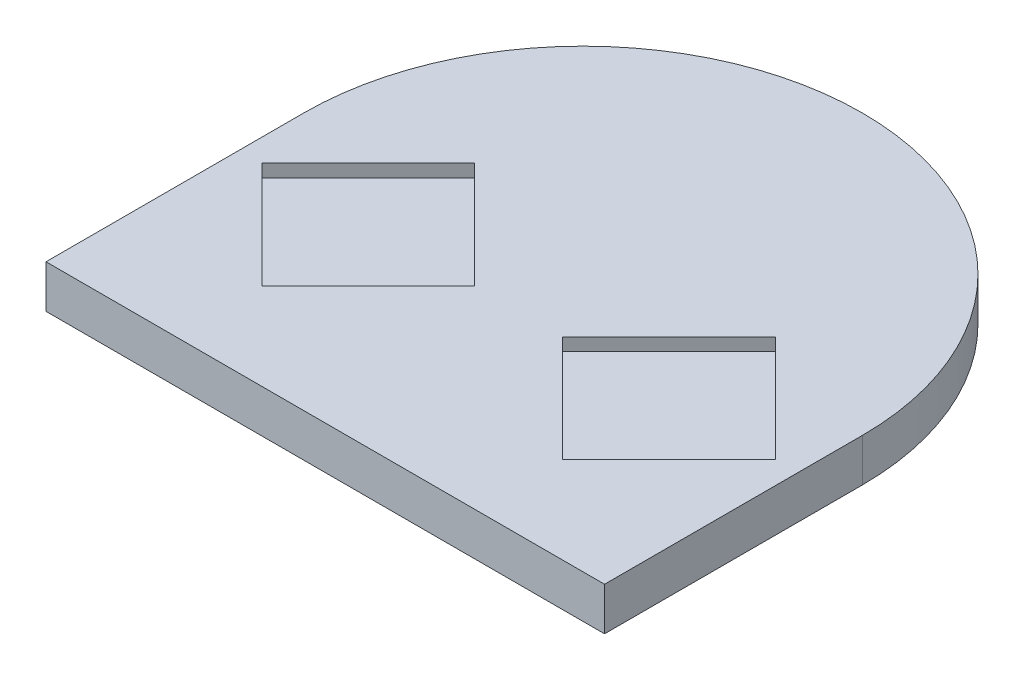
ISO-10303-21;
HEADER;
FILE_DESCRIPTION(('STEP AP214'),'2;1');
FILE_NAME('part.step','',(''),(''),'','','');
FILE_SCHEMA(('AUTOMOTIVE_DESIGN { 1 0 10303 214 1 1 1 1 }'));
ENDSEC;
DATA;
#1=APPLICATION_CONTEXT('core data for automotive mechanical design processes');
#2=APPLICATION_PROTOCOL_DEFINITION('international standard','automotive_design',2000,#1);
#3=PRODUCT_CONTEXT('',#1,'mechanical');
#4=PRODUCT('Part','Part','',(#3));
#5=PRODUCT_RELATED_PRODUCT_CATEGORY('part','',(#4));
#6=PRODUCT_DEFINITION_FORMATION('','',#4);
#7=PRODUCT_DEFINITION_CONTEXT('part definition',#1,'design');
#8=PRODUCT_DEFINITION('design','',#6,#7);
#9=PRODUCT_DEFINITION_SHAPE('','',#8);
#10=(LENGTH_UNIT() NAMED_UNIT(*) SI_UNIT(.MILLI.,.METRE.));
#11=(NAMED_UNIT(*) PLANE_ANGLE_UNIT() SI_UNIT($,.RADIAN.));
#12=(NAMED_UNIT(*) SI_UNIT($,.STERADIAN.) SOLID_ANGLE_UNIT());
#13=UNCERTAINTY_MEASURE_WITH_UNIT(LENGTH_MEASURE(1.E-05),#10,'distance_accuracy_value','');
#14=(GEOMETRIC_REPRESENTATION_CONTEXT(3) GLOBAL_UNCERTAINTY_ASSIGNED_CONTEXT((#13)) GLOBAL_UNIT_ASSIGNED_CONTEXT((#10,
#11,#12)) REPRESENTATION_CONTEXT('',''));
#15=CARTESIAN_POINT('',(0.,0.,0.));
#16=DIRECTION('',(0.,0.,1.));
#17=DIRECTION('',(1.,0.,0.));
#18=AXIS2_PLACEMENT_3D('',#15,#16,#17);
#19=CARTESIAN_POINT('',(65.,10.,0.));
#20=DIRECTION('',(0.,-1.,0.));
#21=DIRECTION('',(0.,0.,-1.));
#22=AXIS2_PLACEMENT_3D('',#19,#20,#21);
#23=CYLINDRICAL_SURFACE('',#22,65.);
#24=CARTESIAN_POINT('',(65.,0.,0.));
#25=DIRECTION('',(0.,1.,0.));
#26=DIRECTION('',(0.,0.,-1.));
#27=AXIS2_PLACEMENT_3D('',#24,#25,#26);
#28=CIRCLE('',#27,65.);
#29=CARTESIAN_POINT('',(130.,0.,0.));
#30=VERTEX_POINT('',#29);
#31=CARTESIAN_POINT('',(0.,0.,0.));
#32=VERTEX_POINT('',#31);
#33=EDGE_CURVE('E179',#30,#32,#28,.T.);
#34=ORIENTED_EDGE('',*,*,#33,.T.);
#35=DIRECTION('',(0.,-1.,0.));
#36=VECTOR('',#35,1.);
#37=CARTESIAN_POINT('',(0.,10.,0.));
#38=LINE('',#37,#36);
#39=CARTESIAN_POINT('',(0.,10.,0.));
#40=VERTEX_POINT('',#39);
#41=EDGE_CURVE('E11',#40,#32,#38,.T.);
#42=ORIENTED_EDGE('',*,*,#41,.F.);
#43=CARTESIAN_POINT('',(65.,10.,0.));
#44=DIRECTION('',(0.,1.,0.));
#45=DIRECTION('',(0.,0.,-1.));
#46=AXIS2_PLACEMENT_3D('',#43,#44,#45);
#47=CIRCLE('',#46,65.);
#48=CARTESIAN_POINT('',(130.,10.,0.));
#49=VERTEX_POINT('',#48);
#50=EDGE_CURVE('E227',#49,#40,#47,.T.);
#51=ORIENTED_EDGE('',*,*,#50,.F.);
#52=DIRECTION('',(0.,-1.,0.));
#53=VECTOR('',#52,1.);
#54=CARTESIAN_POINT('',(130.,10.,0.));
#55=LINE('',#54,#53);
#56=EDGE_CURVE('E241',#49,#30,#55,.T.);
#57=ORIENTED_EDGE('',*,*,#56,.T.);
#58=EDGE_LOOP('',(#34,#42,#51,#57));
#59=FACE_BOUND('',#58,.T.);
#60=ADVANCED_FACE('F45',(#59),#23,.T.);
#61=CARTESIAN_POINT('',(0.,10.,0.));
#62=DIRECTION('',(1.,0.,0.));
#63=DIRECTION('',(0.,0.,-1.));
#64=AXIS2_PLACEMENT_3D('',#61,#62,#63);
#65=PLANE('',#64);
#66=DIRECTION('',(0.,0.,1.));
#67=VECTOR('',#66,1.);
#68=CARTESIAN_POINT('',(0.,0.,0.));
#69=LINE('',#68,#67);
#70=CARTESIAN_POINT('',(0.,0.,60.));
#71=VERTEX_POINT('',#70);
#72=EDGE_CURVE('E245',#32,#71,#69,.T.);
#73=ORIENTED_EDGE('',*,*,#72,.T.);
#74=DIRECTION('',(0.,-1.,0.));
#75=VECTOR('',#74,1.);
#76=CARTESIAN_POINT('',(0.,10.,60.));
#77=LINE('',#76,#75);
#78=CARTESIAN_POINT('',(0.,10.,60.));
#79=VERTEX_POINT('',#78);
#80=EDGE_CURVE('E53',#79,#71,#77,.T.);
#81=ORIENTED_EDGE('',*,*,#80,.F.);
#82=DIRECTION('',(0.,0.,1.));
#83=VECTOR('',#82,1.);
#84=CARTESIAN_POINT('',(0.,10.,0.));
#85=LINE('',#84,#83);
#86=EDGE_CURVE('E231',#40,#79,#85,.T.);
#87=ORIENTED_EDGE('',*,*,#86,.F.);
#88=ORIENTED_EDGE('',*,*,#41,.T.);
#89=EDGE_LOOP('',(#73,#81,#87,#88));
#90=FACE_BOUND('',#89,.T.);
#91=ADVANCED_FACE('F281',(#90),#65,.F.);
#92=CARTESIAN_POINT('',(0.,10.,60.));
#93=DIRECTION('',(0.,0.,-1.));
#94=DIRECTION('',(-1.,0.,0.));
#95=AXIS2_PLACEMENT_3D('',#92,#93,#94);
#96=PLANE('',#95);
#97=DIRECTION('',(1.,0.,0.));
#98=VECTOR('',#97,1.);
#99=CARTESIAN_POINT('',(0.,0.,60.));
#100=LINE('',#99,#98);
#101=CARTESIAN_POINT('',(130.,0.,60.));
#102=VERTEX_POINT('',#101);
#103=EDGE_CURVE('E248',#71,#102,#100,.T.);
#104=ORIENTED_EDGE('',*,*,#103,.T.);
#105=DIRECTION('',(0.,-1.,0.));
#106=VECTOR('',#105,1.);
#107=CARTESIAN_POINT('',(130.,10.,60.));
#108=LINE('',#107,#106);
#109=CARTESIAN_POINT('',(130.,10.,60.));
#110=VERTEX_POINT('',#109);
#111=EDGE_CURVE('E256',#110,#102,#108,.T.);
#112=ORIENTED_EDGE('',*,*,#111,.F.);
#113=DIRECTION('',(1.,0.,0.));
#114=VECTOR('',#113,1.);
#115=CARTESIAN_POINT('',(0.,10.,60.));
#116=LINE('',#115,#114);
#117=EDGE_CURVE('E235',#79,#110,#116,.T.);
#118=ORIENTED_EDGE('',*,*,#117,.F.);
#119=ORIENTED_EDGE('',*,*,#80,.T.);
#120=EDGE_LOOP('',(#104,#112,#118,#119));
#121=FACE_BOUND('',#120,.T.);
#122=ADVANCED_FACE('F265',(#121),#96,.F.);
#123=CARTESIAN_POINT('',(130.,10.,60.));
#124=DIRECTION('',(-1.,0.,0.));
#125=DIRECTION('',(0.,0.,1.));
#126=AXIS2_PLACEMENT_3D('',#123,#124,#125);
#127=PLANE('',#126);
#128=DIRECTION('',(0.,0.,-1.));
#129=VECTOR('',#128,1.);
#130=CARTESIAN_POINT('',(130.,0.,60.));
#131=LINE('',#130,#129);
#132=EDGE_CURVE('E232',#102,#30,#131,.T.);
#133=ORIENTED_EDGE('',*,*,#132,.T.);
#134=ORIENTED_EDGE('',*,*,#56,.F.);
#135=DIRECTION('',(0.,0.,-1.));
#136=VECTOR('',#135,1.);
#137=CARTESIAN_POINT('',(130.,10.,60.));
#138=LINE('',#137,#136);
#139=EDGE_CURVE('E238',#110,#49,#138,.T.);
#140=ORIENTED_EDGE('',*,*,#139,.F.);
#141=ORIENTED_EDGE('',*,*,#111,.T.);
#142=EDGE_LOOP('',(#133,#134,#140,#141));
#143=FACE_BOUND('',#142,.T.);
#144=ADVANCED_FACE('F274',(#143),#127,.F.);
#145=CARTESIAN_POINT('',(65.,10.,0.));
#146=DIRECTION('',(0.,-1.,0.));
#147=DIRECTION('',(0.,0.,-1.));
#148=AXIS2_PLACEMENT_3D('',#145,#146,#147);
#149=PLANE('',#148);
#150=DIRECTION('',(-0.707106781186547,0.,-0.707106781186547));
#151=VECTOR('',#150,1.);
#152=CARTESIAN_POINT('',(124.748737341529,10.,15.));
#153=LINE('',#152,#151);
#154=CARTESIAN_POINT('',(124.748737341529,10.,15.));
#155=VERTEX_POINT('',#154);
#156=CARTESIAN_POINT('',(100.,10.,-9.74873734152919));
#157=VERTEX_POINT('',#156);
#158=EDGE_CURVE('E170',#155,#157,#153,.T.);
#159=ORIENTED_EDGE('',*,*,#158,.F.);
#160=DIRECTION('',(0.707106781186547,0.,-0.707106781186548));
#161=VECTOR('',#160,1.);
#162=CARTESIAN_POINT('',(124.748737341529,10.,15.));
#163=LINE('',#162,#161);
#164=CARTESIAN_POINT('',(100.,10.,39.7487373415291));
#165=VERTEX_POINT('',#164);
#166=EDGE_CURVE('E60',#165,#155,#163,.T.);
#167=ORIENTED_EDGE('',*,*,#166,.F.);
#168=DIRECTION('',(0.707106781186548,0.,0.707106781186547));
#169=VECTOR('',#168,1.);
#170=CARTESIAN_POINT('',(100.,10.,39.7487373415291));
#171=LINE('',#170,#169);
#172=CARTESIAN_POINT('',(75.2512626584709,10.,15.));
#173=VERTEX_POINT('',#172);
#174=EDGE_CURVE('E157',#173,#165,#171,.T.);
#175=ORIENTED_EDGE('',*,*,#174,.F.);
#176=DIRECTION('',(-0.707106781186547,0.,0.707106781186548));
#177=VECTOR('',#176,1.);
#178=CARTESIAN_POINT('',(100.,10.,-9.74873734152919));
#179=LINE('',#178,#177);
#180=EDGE_CURVE('E161',#157,#173,#179,.T.);
#181=ORIENTED_EDGE('',*,*,#180,.F.);
#182=EDGE_LOOP('',(#159,#167,#175,#181));
#183=FACE_BOUND('',#182,.T.);
#184=DIRECTION('',(0.707106781186547,0.,0.707106781186547));
#185=VECTOR('',#184,1.);
#186=CARTESIAN_POINT('',(5.25126265847082,10.,15.));
#187=LINE('',#186,#185);
#188=CARTESIAN_POINT('',(5.25126265847082,10.,15.));
#189=VERTEX_POINT('',#188);
#190=CARTESIAN_POINT('',(30.,10.,39.7487373415291));
#191=VERTEX_POINT('',#190);
#192=EDGE_CURVE('E207',#189,#191,#187,.T.);
#193=ORIENTED_EDGE('',*,*,#192,.F.);
#194=DIRECTION('',(-0.707106781186547,0.,0.707106781186548));
#195=VECTOR('',#194,1.);
#196=CARTESIAN_POINT('',(5.25126265847082,10.,15.));
#197=LINE('',#196,#195);
#198=CARTESIAN_POINT('',(30.,10.,-9.74873734152918));
#199=VERTEX_POINT('',#198);
#200=EDGE_CURVE('E68',#199,#189,#197,.T.);
#201=ORIENTED_EDGE('',*,*,#200,.F.);
#202=DIRECTION('',(-0.707106781186547,0.,-0.707106781186548));
#203=VECTOR('',#202,1.);
#204=CARTESIAN_POINT('',(30.,10.,-9.74873734152918));
#205=LINE('',#204,#203);
#206=CARTESIAN_POINT('',(54.7487373415291,10.,15.));
#207=VERTEX_POINT('',#206);
#208=EDGE_CURVE('E198',#207,#199,#205,.T.);
#209=ORIENTED_EDGE('',*,*,#208,.F.);
#210=DIRECTION('',(0.707106781186547,0.,-0.707106781186547));
#211=VECTOR('',#210,1.);
#212=CARTESIAN_POINT('',(30.,10.,39.7487373415291));
#213=LINE('',#212,#211);
#214=EDGE_CURVE('E202',#191,#207,#213,.T.);
#215=ORIENTED_EDGE('',*,*,#214,.F.);
#216=EDGE_LOOP('',(#193,#201,#209,#215));
#217=FACE_BOUND('',#216,.T.);
#218=ORIENTED_EDGE('',*,*,#50,.T.);
#219=ORIENTED_EDGE('',*,*,#86,.T.);
#220=ORIENTED_EDGE('',*,*,#117,.T.);
#221=ORIENTED_EDGE('',*,*,#139,.T.);
#222=EDGE_LOOP('',(#218,#219,#220,#221));
#223=FACE_BOUND('',#222,.T.);
#224=ADVANCED_FACE('F280',(#183,#217,#223),#149,.F.);
#225=CARTESIAN_POINT('',(65.,0.,0.));
#226=DIRECTION('',(0.,-1.,0.));
#227=DIRECTION('',(0.,0.,-1.));
#228=AXIS2_PLACEMENT_3D('',#225,#226,#227);
#229=PLANE('',#228);
#230=ORIENTED_EDGE('',*,*,#33,.F.);
#231=ORIENTED_EDGE('',*,*,#132,.F.);
#232=ORIENTED_EDGE('',*,*,#103,.F.);
#233=ORIENTED_EDGE('',*,*,#72,.F.);
#234=EDGE_LOOP('',(#230,#231,#232,#233));
#235=FACE_BOUND('',#234,.T.);
#236=ADVANCED_FACE('F271',(#235),#229,.T.);
#237=CARTESIAN_POINT('',(5.25126265847082,7.,15.));
#238=DIRECTION('',(-0.707106781186548,0.,-0.707106781186547));
#239=DIRECTION('',(-0.707106781186547,0.,0.707106781186548));
#240=AXIS2_PLACEMENT_3D('',#237,#238,#239);
#241=PLANE('',#240);
#242=ORIENTED_EDGE('',*,*,#200,.T.);
#243=DIRECTION('',(0.,1.,0.));
#244=VECTOR('',#243,1.);
#245=CARTESIAN_POINT('',(5.25126265847082,7.,15.));
#246=LINE('',#245,#244);
#247=CARTESIAN_POINT('',(5.25126265847082,7.,15.));
#248=VERTEX_POINT('',#247);
#249=EDGE_CURVE('E185',#248,#189,#246,.T.);
#250=ORIENTED_EDGE('',*,*,#249,.F.);
#251=DIRECTION('',(-0.707106781186547,0.,0.707106781186548));
#252=VECTOR('',#251,1.);
#253=CARTESIAN_POINT('',(5.25126265847082,7.,15.));
#254=LINE('',#253,#252);
#255=CARTESIAN_POINT('',(30.,7.,-9.74873734152918));
#256=VERTEX_POINT('',#255);
#257=EDGE_CURVE('E203',#256,#248,#254,.T.);
#258=ORIENTED_EDGE('',*,*,#257,.F.);
#259=DIRECTION('',(0.,1.,0.));
#260=VECTOR('',#259,1.);
#261=CARTESIAN_POINT('',(30.,7.,-9.74873734152918));
#262=LINE('',#261,#260);
#263=EDGE_CURVE('E195',#256,#199,#262,.T.);
#264=ORIENTED_EDGE('',*,*,#263,.T.);
#265=EDGE_LOOP('',(#242,#250,#258,#264));
#266=FACE_BOUND('',#265,.T.);
#267=ADVANCED_FACE('F293',(#266),#241,.F.);
#268=CARTESIAN_POINT('',(30.,7.,-9.74873734152918));
#269=DIRECTION('',(0.707106781186548,0.,-0.707106781186547));
#270=DIRECTION('',(-0.707106781186547,0.,-0.707106781186548));
#271=AXIS2_PLACEMENT_3D('',#268,#269,#270);
#272=PLANE('',#271);
#273=ORIENTED_EDGE('',*,*,#208,.T.);
#274=ORIENTED_EDGE('',*,*,#263,.F.);
#275=DIRECTION('',(-0.707106781186547,0.,-0.707106781186548));
#276=VECTOR('',#275,1.);
#277=CARTESIAN_POINT('',(30.,7.,-9.74873734152918));
#278=LINE('',#277,#276);
#279=CARTESIAN_POINT('',(54.7487373415291,7.,15.));
#280=VERTEX_POINT('',#279);
#281=EDGE_CURVE('E188',#280,#256,#278,.T.);
#282=ORIENTED_EDGE('',*,*,#281,.F.);
#283=DIRECTION('',(0.,1.,0.));
#284=VECTOR('',#283,1.);
#285=CARTESIAN_POINT('',(54.7487373415291,7.,15.));
#286=LINE('',#285,#284);
#287=EDGE_CURVE('E192',#280,#207,#286,.T.);
#288=ORIENTED_EDGE('',*,*,#287,.T.);
#289=EDGE_LOOP('',(#273,#274,#282,#288));
#290=FACE_BOUND('',#289,.T.);
#291=ADVANCED_FACE('F302',(#290),#272,.F.);
#292=CARTESIAN_POINT('',(30.,7.,39.7487373415291));
#293=DIRECTION('',(0.707106781186548,0.,0.707106781186548));
#294=DIRECTION('',(0.707106781186548,0.,-0.707106781186548));
#295=AXIS2_PLACEMENT_3D('',#292,#293,#294);
#296=PLANE('',#295);
#297=ORIENTED_EDGE('',*,*,#214,.T.);
#298=ORIENTED_EDGE('',*,*,#287,.F.);
#299=DIRECTION('',(0.707106781186547,0.,-0.707106781186547));
#300=VECTOR('',#299,1.);
#301=CARTESIAN_POINT('',(30.,7.,39.7487373415291));
#302=LINE('',#301,#300);
#303=CARTESIAN_POINT('',(30.,7.,39.7487373415291));
#304=VERTEX_POINT('',#303);
#305=EDGE_CURVE('E216',#304,#280,#302,.T.);
#306=ORIENTED_EDGE('',*,*,#305,.F.);
#307=DIRECTION('',(0.,1.,0.));
#308=VECTOR('',#307,1.);
#309=CARTESIAN_POINT('',(30.,7.,39.7487373415291));
#310=LINE('',#309,#308);
#311=EDGE_CURVE('E189',#304,#191,#310,.T.);
#312=ORIENTED_EDGE('',*,*,#311,.T.);
#313=EDGE_LOOP('',(#297,#298,#306,#312));
#314=FACE_BOUND('',#313,.T.);
#315=ADVANCED_FACE('F305',(#314),#296,.F.);
#316=CARTESIAN_POINT('',(5.25126265847082,7.,15.));
#317=DIRECTION('',(-0.707106781186548,0.,0.707106781186548));
#318=DIRECTION('',(0.707106781186548,0.,0.707106781186548));
#319=AXIS2_PLACEMENT_3D('',#316,#317,#318);
#320=PLANE('',#319);
#321=ORIENTED_EDGE('',*,*,#192,.T.);
#322=ORIENTED_EDGE('',*,*,#311,.F.);
#323=DIRECTION('',(0.707106781186547,0.,0.707106781186547));
#324=VECTOR('',#323,1.);
#325=CARTESIAN_POINT('',(5.25126265847082,7.,15.));
#326=LINE('',#325,#324);
#327=EDGE_CURVE('E220',#248,#304,#326,.T.);
#328=ORIENTED_EDGE('',*,*,#327,.F.);
#329=ORIENTED_EDGE('',*,*,#249,.T.);
#330=EDGE_LOOP('',(#321,#322,#328,#329));
#331=FACE_BOUND('',#330,.T.);
#332=ADVANCED_FACE('F300',(#331),#320,.F.);
#333=CARTESIAN_POINT('',(0.,7.,0.));
#334=DIRECTION('',(0.,-1.,0.));
#335=DIRECTION('',(0.,0.,-1.));
#336=AXIS2_PLACEMENT_3D('',#333,#334,#335);
#337=PLANE('',#336);
#338=ORIENTED_EDGE('',*,*,#257,.T.);
#339=ORIENTED_EDGE('',*,*,#327,.T.);
#340=ORIENTED_EDGE('',*,*,#305,.T.);
#341=ORIENTED_EDGE('',*,*,#281,.T.);
#342=EDGE_LOOP('',(#338,#339,#340,#341));
#343=FACE_BOUND('',#342,.T.);
#344=ADVANCED_FACE('F297',(#343),#337,.F.);
#345=CARTESIAN_POINT('',(124.748737341529,7.,15.));
#346=DIRECTION('',(0.707106781186548,0.,0.707106781186547));
#347=DIRECTION('',(0.707106781186547,0.,-0.707106781186548));
#348=AXIS2_PLACEMENT_3D('',#345,#346,#347);
#349=PLANE('',#348);
#350=ORIENTED_EDGE('',*,*,#166,.T.);
#351=DIRECTION('',(0.,1.,0.));
#352=VECTOR('',#351,1.);
#353=CARTESIAN_POINT('',(124.748737341529,7.,15.));
#354=LINE('',#353,#352);
#355=CARTESIAN_POINT('',(124.748737341529,7.,15.));
#356=VERTEX_POINT('',#355);
#357=EDGE_CURVE('E132',#356,#155,#354,.T.);
#358=ORIENTED_EDGE('',*,*,#357,.F.);
#359=DIRECTION('',(0.707106781186547,0.,-0.707106781186548));
#360=VECTOR('',#359,1.);
#361=CARTESIAN_POINT('',(124.748737341529,7.,15.));
#362=LINE('',#361,#360);
#363=CARTESIAN_POINT('',(100.,7.,39.7487373415291));
#364=VERTEX_POINT('',#363);
#365=EDGE_CURVE('E136',#364,#356,#362,.T.);
#366=ORIENTED_EDGE('',*,*,#365,.F.);
#367=DIRECTION('',(0.,1.,0.));
#368=VECTOR('',#367,1.);
#369=CARTESIAN_POINT('',(100.,7.,39.7487373415291));
#370=LINE('',#369,#368);
#371=EDGE_CURVE('E176',#364,#165,#370,.T.);
#372=ORIENTED_EDGE('',*,*,#371,.T.);
#373=EDGE_LOOP('',(#350,#358,#366,#372));
#374=FACE_BOUND('',#373,.T.);
#375=ADVANCED_FACE('F134',(#374),#349,.F.);
#376=CARTESIAN_POINT('',(100.,7.,39.7487373415291));
#377=DIRECTION('',(-0.707106781186547,0.,0.707106781186548));
#378=DIRECTION('',(0.707106781186548,0.,0.707106781186547));
#379=AXIS2_PLACEMENT_3D('',#376,#377,#378);
#380=PLANE('',#379);
#381=ORIENTED_EDGE('',*,*,#174,.T.);
#382=ORIENTED_EDGE('',*,*,#371,.F.);
#383=DIRECTION('',(0.707106781186548,0.,0.707106781186547));
#384=VECTOR('',#383,1.);
#385=CARTESIAN_POINT('',(100.,7.,39.7487373415291));
#386=LINE('',#385,#384);
#387=CARTESIAN_POINT('',(75.2512626584709,7.,15.));
#388=VERTEX_POINT('',#387);
#389=EDGE_CURVE('E143',#388,#364,#386,.T.);
#390=ORIENTED_EDGE('',*,*,#389,.F.);
#391=DIRECTION('',(0.,1.,0.));
#392=VECTOR('',#391,1.);
#393=CARTESIAN_POINT('',(75.2512626584709,7.,15.));
#394=LINE('',#393,#392);
#395=EDGE_CURVE('E180',#388,#173,#394,.T.);
#396=ORIENTED_EDGE('',*,*,#395,.T.);
#397=EDGE_LOOP('',(#381,#382,#390,#396));
#398=FACE_BOUND('',#397,.T.);
#399=ADVANCED_FACE('F317',(#398),#380,.F.);
#400=CARTESIAN_POINT('',(100.,7.,-9.74873734152919));
#401=DIRECTION('',(-0.707106781186548,0.,-0.707106781186547));
#402=DIRECTION('',(-0.707106781186547,0.,0.707106781186548));
#403=AXIS2_PLACEMENT_3D('',#400,#401,#402);
#404=PLANE('',#403);
#405=ORIENTED_EDGE('',*,*,#180,.T.);
#406=ORIENTED_EDGE('',*,*,#395,.F.);
#407=DIRECTION('',(-0.707106781186547,0.,0.707106781186548));
#408=VECTOR('',#407,1.);
#409=CARTESIAN_POINT('',(100.,7.,-9.74873734152919));
#410=LINE('',#409,#408);
#411=CARTESIAN_POINT('',(100.,7.,-9.74873734152919));
#412=VERTEX_POINT('',#411);
#413=EDGE_CURVE('E152',#412,#388,#410,.T.);
#414=ORIENTED_EDGE('',*,*,#413,.F.);
#415=DIRECTION('',(0.,1.,0.));
#416=VECTOR('',#415,1.);
#417=CARTESIAN_POINT('',(100.,7.,-9.74873734152919));
#418=LINE('',#417,#416);
#419=EDGE_CURVE('E142',#412,#157,#418,.T.);
#420=ORIENTED_EDGE('',*,*,#419,.T.);
#421=EDGE_LOOP('',(#405,#406,#414,#420));
#422=FACE_BOUND('',#421,.T.);
#423=ADVANCED_FACE('F320',(#422),#404,.F.);
#424=CARTESIAN_POINT('',(124.748737341529,7.,15.));
#425=DIRECTION('',(0.707106781186548,0.,-0.707106781186548));
#426=DIRECTION('',(-0.707106781186548,0.,-0.707106781186548));
#427=AXIS2_PLACEMENT_3D('',#424,#425,#426);
#428=PLANE('',#427);
#429=ORIENTED_EDGE('',*,*,#158,.T.);
#430=ORIENTED_EDGE('',*,*,#419,.F.);
#431=DIRECTION('',(-0.707106781186547,0.,-0.707106781186547));
#432=VECTOR('',#431,1.);
#433=CARTESIAN_POINT('',(124.748737341529,7.,15.));
#434=LINE('',#433,#432);
#435=EDGE_CURVE('E146',#356,#412,#434,.T.);
#436=ORIENTED_EDGE('',*,*,#435,.F.);
#437=ORIENTED_EDGE('',*,*,#357,.T.);
#438=EDGE_LOOP('',(#429,#430,#436,#437));
#439=FACE_BOUND('',#438,.T.);
#440=ADVANCED_FACE('F147',(#439),#428,.F.);
#441=CARTESIAN_POINT('',(0.,7.,0.));
#442=DIRECTION('',(0.,-1.,0.));
#443=DIRECTION('',(0.,0.,-1.));
#444=AXIS2_PLACEMENT_3D('',#441,#442,#443);
#445=PLANE('',#444);
#446=ORIENTED_EDGE('',*,*,#365,.T.);
#447=ORIENTED_EDGE('',*,*,#435,.T.);
#448=ORIENTED_EDGE('',*,*,#413,.T.);
#449=ORIENTED_EDGE('',*,*,#389,.T.);
#450=EDGE_LOOP('',(#446,#447,#448,#449));
#451=FACE_BOUND('',#450,.T.);
#452=ADVANCED_FACE('F154',(#451),#445,.F.);
#453=CLOSED_SHELL('',(#60,#91,#122,#144,#224,#236,#267,#291,#315,#332,#344,#375,#399,#423,#440,#452));
#454=MANIFOLD_SOLID_BREP('B2',#453);
#455=ADVANCED_BREP_SHAPE_REPRESENTATION('',(#18,#454),#14);
#456=SHAPE_DEFINITION_REPRESENTATION(#9,#455);
ENDSEC;
END-ISO-10303-21;
